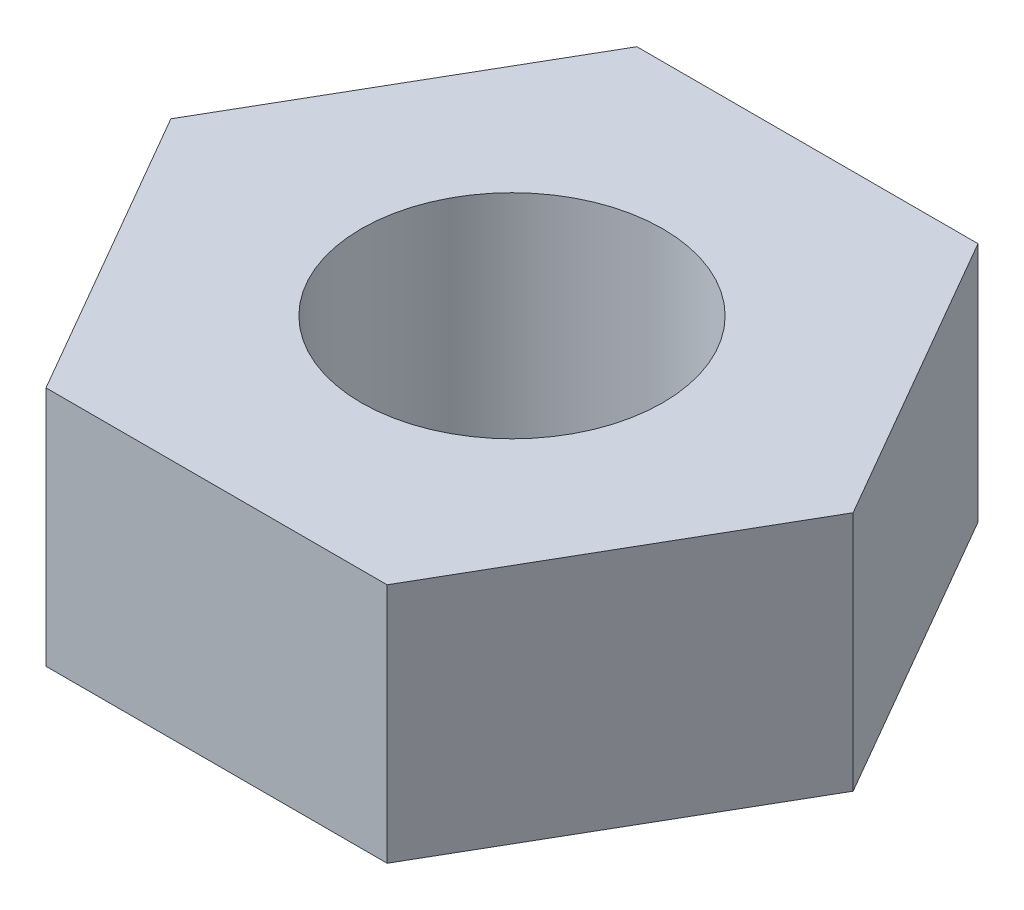
ISO-10303-21;
HEADER;
FILE_DESCRIPTION(('STEP AP214'),'2;1');
FILE_NAME('part.step','',(''),(''),'','','');
FILE_SCHEMA(('AUTOMOTIVE_DESIGN { 1 0 10303 214 1 1 1 1 }'));
ENDSEC;
DATA;
#1=APPLICATION_CONTEXT('core data for automotive mechanical design processes');
#2=APPLICATION_PROTOCOL_DEFINITION('international standard','automotive_design',2000,#1);
#3=PRODUCT_CONTEXT('',#1,'mechanical');
#4=PRODUCT('Part','Part','',(#3));
#5=PRODUCT_RELATED_PRODUCT_CATEGORY('part','',(#4));
#6=PRODUCT_DEFINITION_FORMATION('','',#4);
#7=PRODUCT_DEFINITION_CONTEXT('part definition',#1,'design');
#8=PRODUCT_DEFINITION('design','',#6,#7);
#9=PRODUCT_DEFINITION_SHAPE('','',#8);
#10=(LENGTH_UNIT() NAMED_UNIT(*) SI_UNIT(.MILLI.,.METRE.));
#11=(NAMED_UNIT(*) PLANE_ANGLE_UNIT() SI_UNIT($,.RADIAN.));
#12=(NAMED_UNIT(*) SI_UNIT($,.STERADIAN.) SOLID_ANGLE_UNIT());
#13=UNCERTAINTY_MEASURE_WITH_UNIT(LENGTH_MEASURE(1.E-05),#10,'distance_accuracy_value','');
#14=(GEOMETRIC_REPRESENTATION_CONTEXT(3) GLOBAL_UNCERTAINTY_ASSIGNED_CONTEXT((#13)) GLOBAL_UNIT_ASSIGNED_CONTEXT((#10,
#11,#12)) REPRESENTATION_CONTEXT('',''));
#15=CARTESIAN_POINT('',(0.,0.,0.));
#16=DIRECTION('',(0.,0.,1.));
#17=DIRECTION('',(1.,0.,0.));
#18=AXIS2_PLACEMENT_3D('',#15,#16,#17);
#19=CARTESIAN_POINT('',(0.,2.,0.));
#20=DIRECTION('',(0.,1.,0.));
#21=DIRECTION('',(0.,0.,1.));
#22=AXIS2_PLACEMENT_3D('',#19,#20,#21);
#23=PLANE('',#22);
#24=DIRECTION('',(-0.5,0.,-0.866025403784439));
#25=VECTOR('',#24,1.);
#26=CARTESIAN_POINT('',(2.82901631902917,2.,0.));
#27=LINE('',#26,#25);
#28=CARTESIAN_POINT('',(2.82901631902917,2.,0.));
#29=VERTEX_POINT('',#28);
#30=CARTESIAN_POINT('',(1.41450815951458,2.,-2.45));
#31=VERTEX_POINT('',#30);
#32=EDGE_CURVE('E146',#29,#31,#27,.T.);
#33=ORIENTED_EDGE('',*,*,#32,.T.);
#34=DIRECTION('',(-1.,0.,0.));
#35=VECTOR('',#34,1.);
#36=CARTESIAN_POINT('',(1.41450815951458,2.,-2.45));
#37=LINE('',#36,#35);
#38=CARTESIAN_POINT('',(-1.41450815951458,2.,-2.45));
#39=VERTEX_POINT('',#38);
#40=EDGE_CURVE('E94',#31,#39,#37,.T.);
#41=ORIENTED_EDGE('',*,*,#40,.T.);
#42=DIRECTION('',(-0.5,0.,0.866025403784439));
#43=VECTOR('',#42,1.);
#44=CARTESIAN_POINT('',(-1.41450815951458,2.,-2.45));
#45=LINE('',#44,#43);
#46=CARTESIAN_POINT('',(-2.82901631902917,2.,0.));
#47=VERTEX_POINT('',#46);
#48=EDGE_CURVE('E107',#39,#47,#45,.T.);
#49=ORIENTED_EDGE('',*,*,#48,.T.);
#50=DIRECTION('',(0.5,0.,0.866025403784439));
#51=VECTOR('',#50,1.);
#52=CARTESIAN_POINT('',(-2.82901631902917,2.,0.));
#53=LINE('',#52,#51);
#54=CARTESIAN_POINT('',(-1.41450815951458,2.,2.45));
#55=VERTEX_POINT('',#54);
#56=EDGE_CURVE('E101',#47,#55,#53,.T.);
#57=ORIENTED_EDGE('',*,*,#56,.T.);
#58=DIRECTION('',(1.,0.,0.));
#59=VECTOR('',#58,1.);
#60=CARTESIAN_POINT('',(-1.41450815951458,2.,2.45));
#61=LINE('',#60,#59);
#62=CARTESIAN_POINT('',(1.41450815951458,2.,2.45));
#63=VERTEX_POINT('',#62);
#64=EDGE_CURVE('E105',#55,#63,#61,.T.);
#65=ORIENTED_EDGE('',*,*,#64,.T.);
#66=DIRECTION('',(0.5,0.,-0.866025403784439));
#67=VECTOR('',#66,1.);
#68=CARTESIAN_POINT('',(1.41450815951458,2.,2.45));
#69=LINE('',#68,#67);
#70=EDGE_CURVE('E57',#63,#29,#69,.T.);
#71=ORIENTED_EDGE('',*,*,#70,.T.);
#72=EDGE_LOOP('',(#33,#41,#49,#57,#65,#71));
#73=FACE_BOUND('',#72,.T.);
#74=CARTESIAN_POINT('',(0.,2.,0.));
#75=DIRECTION('',(0.,1.,0.));
#76=DIRECTION('',(0.,0.,1.));
#77=AXIS2_PLACEMENT_3D('',#74,#75,#76);
#78=CIRCLE('',#77,1.25);
#79=CARTESIAN_POINT('',(0.,2.,1.25));
#80=VERTEX_POINT('',#79);
#81=EDGE_CURVE('E134',#80,#80,#78,.T.);
#82=ORIENTED_EDGE('',*,*,#81,.F.);
#83=EDGE_LOOP('',(#82));
#84=FACE_BOUND('',#83,.T.);
#85=ADVANCED_FACE('F39',(#73,#84),#23,.T.);
#86=CARTESIAN_POINT('',(0.,0.,0.));
#87=DIRECTION('',(0.,1.,0.));
#88=DIRECTION('',(0.,0.,1.));
#89=AXIS2_PLACEMENT_3D('',#86,#87,#88);
#90=PLANE('',#89);
#91=DIRECTION('',(-0.5,0.,-0.866025403784439));
#92=VECTOR('',#91,1.);
#93=CARTESIAN_POINT('',(2.82901631902917,0.,0.));
#94=LINE('',#93,#92);
#95=CARTESIAN_POINT('',(2.82901631902917,0.,0.));
#96=VERTEX_POINT('',#95);
#97=CARTESIAN_POINT('',(1.41450815951458,0.,-2.45));
#98=VERTEX_POINT('',#97);
#99=EDGE_CURVE('E129',#96,#98,#94,.T.);
#100=ORIENTED_EDGE('',*,*,#99,.F.);
#101=DIRECTION('',(0.5,0.,-0.866025403784439));
#102=VECTOR('',#101,1.);
#103=CARTESIAN_POINT('',(1.41450815951458,0.,2.45));
#104=LINE('',#103,#102);
#105=CARTESIAN_POINT('',(1.41450815951458,0.,2.45));
#106=VERTEX_POINT('',#105);
#107=EDGE_CURVE('E86',#106,#96,#104,.T.);
#108=ORIENTED_EDGE('',*,*,#107,.F.);
#109=DIRECTION('',(1.,0.,0.));
#110=VECTOR('',#109,1.);
#111=CARTESIAN_POINT('',(-1.41450815951458,0.,2.45));
#112=LINE('',#111,#110);
#113=CARTESIAN_POINT('',(-1.41450815951458,0.,2.45));
#114=VERTEX_POINT('',#113);
#115=EDGE_CURVE('E80',#114,#106,#112,.T.);
#116=ORIENTED_EDGE('',*,*,#115,.F.);
#117=DIRECTION('',(0.5,0.,0.866025403784439));
#118=VECTOR('',#117,1.);
#119=CARTESIAN_POINT('',(-2.82901631902917,0.,0.));
#120=LINE('',#119,#118);
#121=CARTESIAN_POINT('',(-2.82901631902917,0.,0.));
#122=VERTEX_POINT('',#121);
#123=EDGE_CURVE('E116',#122,#114,#120,.T.);
#124=ORIENTED_EDGE('',*,*,#123,.F.);
#125=DIRECTION('',(-0.5,0.,0.866025403784439));
#126=VECTOR('',#125,1.);
#127=CARTESIAN_POINT('',(-1.41450815951458,0.,-2.45));
#128=LINE('',#127,#126);
#129=CARTESIAN_POINT('',(-1.41450815951458,0.,-2.45));
#130=VERTEX_POINT('',#129);
#131=EDGE_CURVE('E137',#130,#122,#128,.T.);
#132=ORIENTED_EDGE('',*,*,#131,.F.);
#133=DIRECTION('',(-1.,0.,0.));
#134=VECTOR('',#133,1.);
#135=CARTESIAN_POINT('',(1.41450815951458,0.,-2.45));
#136=LINE('',#135,#134);
#137=EDGE_CURVE('E133',#98,#130,#136,.T.);
#138=ORIENTED_EDGE('',*,*,#137,.F.);
#139=EDGE_LOOP('',(#100,#108,#116,#124,#132,#138));
#140=FACE_BOUND('',#139,.T.);
#141=CARTESIAN_POINT('',(0.,0.,0.));
#142=DIRECTION('',(0.,1.,0.));
#143=DIRECTION('',(0.,0.,1.));
#144=AXIS2_PLACEMENT_3D('',#141,#142,#143);
#145=CIRCLE('',#144,1.25);
#146=CARTESIAN_POINT('',(0.,0.,1.25));
#147=VERTEX_POINT('',#146);
#148=EDGE_CURVE('E243',#147,#147,#145,.T.);
#149=ORIENTED_EDGE('',*,*,#148,.T.);
#150=EDGE_LOOP('',(#149));
#151=FACE_BOUND('',#150,.T.);
#152=ADVANCED_FACE('F159',(#140,#151),#90,.F.);
#153=CARTESIAN_POINT('',(2.82901631902917,2.,0.));
#154=DIRECTION('',(-0.866025403784439,0.,0.5));
#155=DIRECTION('',(0.5,0.,0.866025403784439));
#156=AXIS2_PLACEMENT_3D('',#153,#154,#155);
#157=PLANE('',#156);
#158=ORIENTED_EDGE('',*,*,#99,.T.);
#159=DIRECTION('',(0.,-1.,0.));
#160=VECTOR('',#159,1.);
#161=CARTESIAN_POINT('',(1.41450815951458,2.,-2.45));
#162=LINE('',#161,#160);
#163=EDGE_CURVE('E11',#31,#98,#162,.T.);
#164=ORIENTED_EDGE('',*,*,#163,.F.);
#165=ORIENTED_EDGE('',*,*,#32,.F.);
#166=DIRECTION('',(0.,-1.,0.));
#167=VECTOR('',#166,1.);
#168=CARTESIAN_POINT('',(2.82901631902917,2.,0.));
#169=LINE('',#168,#167);
#170=EDGE_CURVE('E125',#29,#96,#169,.T.);
#171=ORIENTED_EDGE('',*,*,#170,.T.);
#172=EDGE_LOOP('',(#158,#164,#165,#171));
#173=FACE_BOUND('',#172,.T.);
#174=ADVANCED_FACE('F41',(#173),#157,.F.);
#175=CARTESIAN_POINT('',(1.41450815951458,2.,-2.45));
#176=DIRECTION('',(0.,0.,1.));
#177=DIRECTION('',(1.,0.,0.));
#178=AXIS2_PLACEMENT_3D('',#175,#176,#177);
#179=PLANE('',#178);
#180=ORIENTED_EDGE('',*,*,#137,.T.);
#181=DIRECTION('',(0.,-1.,0.));
#182=VECTOR('',#181,1.);
#183=CARTESIAN_POINT('',(-1.41450815951458,2.,-2.45));
#184=LINE('',#183,#182);
#185=EDGE_CURVE('E49',#39,#130,#184,.T.);
#186=ORIENTED_EDGE('',*,*,#185,.F.);
#187=ORIENTED_EDGE('',*,*,#40,.F.);
#188=ORIENTED_EDGE('',*,*,#163,.T.);
#189=EDGE_LOOP('',(#180,#186,#187,#188));
#190=FACE_BOUND('',#189,.T.);
#191=ADVANCED_FACE('F184',(#190),#179,.F.);
#192=CARTESIAN_POINT('',(-1.41450815951458,2.,-2.45));
#193=DIRECTION('',(0.866025403784439,0.,0.5));
#194=DIRECTION('',(0.5,0.,-0.866025403784439));
#195=AXIS2_PLACEMENT_3D('',#192,#193,#194);
#196=PLANE('',#195);
#197=ORIENTED_EDGE('',*,*,#131,.T.);
#198=DIRECTION('',(0.,-1.,0.));
#199=VECTOR('',#198,1.);
#200=CARTESIAN_POINT('',(-2.82901631902917,2.,0.));
#201=LINE('',#200,#199);
#202=EDGE_CURVE('E118',#47,#122,#201,.T.);
#203=ORIENTED_EDGE('',*,*,#202,.F.);
#204=ORIENTED_EDGE('',*,*,#48,.F.);
#205=ORIENTED_EDGE('',*,*,#185,.T.);
#206=EDGE_LOOP('',(#197,#203,#204,#205));
#207=FACE_BOUND('',#206,.T.);
#208=ADVANCED_FACE('F156',(#207),#196,.F.);
#209=CARTESIAN_POINT('',(-2.82901631902917,2.,0.));
#210=DIRECTION('',(0.866025403784438,0.,-0.5));
#211=DIRECTION('',(-0.5,0.,-0.866025403784439));
#212=AXIS2_PLACEMENT_3D('',#209,#210,#211);
#213=PLANE('',#212);
#214=ORIENTED_EDGE('',*,*,#123,.T.);
#215=DIRECTION('',(0.,-1.,0.));
#216=VECTOR('',#215,1.);
#217=CARTESIAN_POINT('',(-1.41450815951458,2.,2.45));
#218=LINE('',#217,#216);
#219=EDGE_CURVE('E113',#55,#114,#218,.T.);
#220=ORIENTED_EDGE('',*,*,#219,.F.);
#221=ORIENTED_EDGE('',*,*,#56,.F.);
#222=ORIENTED_EDGE('',*,*,#202,.T.);
#223=EDGE_LOOP('',(#214,#220,#221,#222));
#224=FACE_BOUND('',#223,.T.);
#225=ADVANCED_FACE('F114',(#224),#213,.F.);
#226=CARTESIAN_POINT('',(-1.41450815951458,2.,2.45));
#227=DIRECTION('',(0.,0.,-1.));
#228=DIRECTION('',(-1.,0.,0.));
#229=AXIS2_PLACEMENT_3D('',#226,#227,#228);
#230=PLANE('',#229);
#231=ORIENTED_EDGE('',*,*,#115,.T.);
#232=DIRECTION('',(0.,-1.,0.));
#233=VECTOR('',#232,1.);
#234=CARTESIAN_POINT('',(1.41450815951458,2.,2.45));
#235=LINE('',#234,#233);
#236=EDGE_CURVE('E119',#63,#106,#235,.T.);
#237=ORIENTED_EDGE('',*,*,#236,.F.);
#238=ORIENTED_EDGE('',*,*,#64,.F.);
#239=ORIENTED_EDGE('',*,*,#219,.T.);
#240=EDGE_LOOP('',(#231,#237,#238,#239));
#241=FACE_BOUND('',#240,.T.);
#242=ADVANCED_FACE('F121',(#241),#230,.F.);
#243=CARTESIAN_POINT('',(1.41450815951458,2.,2.45));
#244=DIRECTION('',(-0.866025403784439,0.,-0.5));
#245=DIRECTION('',(-0.5,0.,0.866025403784439));
#246=AXIS2_PLACEMENT_3D('',#243,#244,#245);
#247=PLANE('',#246);
#248=ORIENTED_EDGE('',*,*,#107,.T.);
#249=ORIENTED_EDGE('',*,*,#170,.F.);
#250=ORIENTED_EDGE('',*,*,#70,.F.);
#251=ORIENTED_EDGE('',*,*,#236,.T.);
#252=EDGE_LOOP('',(#248,#249,#250,#251));
#253=FACE_BOUND('',#252,.T.);
#254=ADVANCED_FACE('F164',(#253),#247,.F.);
#255=CARTESIAN_POINT('',(0.,2.,0.));
#256=DIRECTION('',(0.,-1.,0.));
#257=DIRECTION('',(0.,0.,-1.));
#258=AXIS2_PLACEMENT_3D('',#255,#256,#257);
#259=CYLINDRICAL_SURFACE('',#258,1.25);
#260=ORIENTED_EDGE('',*,*,#81,.T.);
#261=EDGE_LOOP('',(#260));
#262=FACE_BOUND('',#261,.T.);
#263=ORIENTED_EDGE('',*,*,#148,.F.);
#264=EDGE_LOOP('',(#263));
#265=FACE_BOUND('',#264,.T.);
#266=ADVANCED_FACE('F166',(#262,#265),#259,.F.);
#267=CLOSED_SHELL('',(#85,#152,#174,#191,#208,#225,#242,#254,#266));
#268=MANIFOLD_SOLID_BREP('B2',#267);
#269=ADVANCED_BREP_SHAPE_REPRESENTATION('',(#18,#268),#14);
#270=SHAPE_DEFINITION_REPRESENTATION(#9,#269);
ENDSEC;
END-ISO-10303-21;
